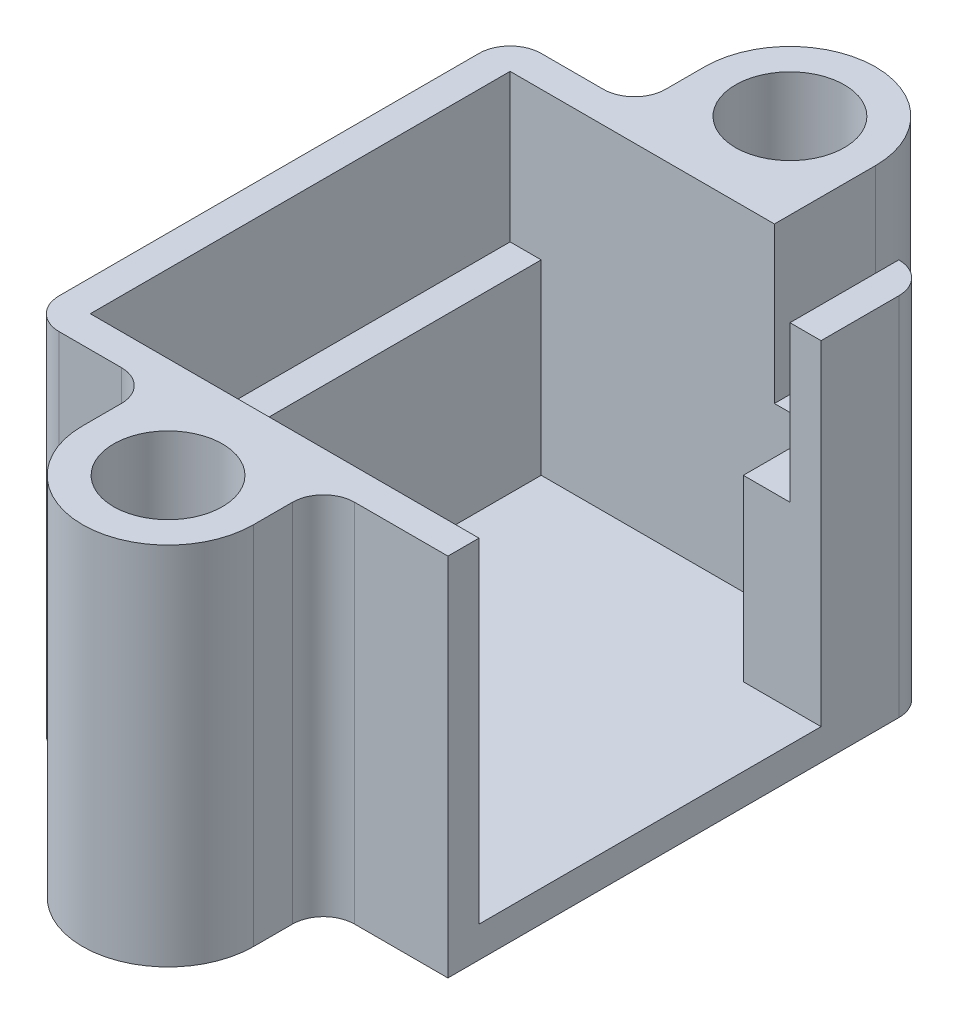
ISO-10303-21;
HEADER;
FILE_DESCRIPTION(('STEP AP214'),'2;1');
FILE_NAME('part.step','',(''),(''),'','','');
FILE_SCHEMA(('AUTOMOTIVE_DESIGN { 1 0 10303 214 1 1 1 1 }'));
ENDSEC;
DATA;
#1=APPLICATION_CONTEXT('core data for automotive mechanical design processes');
#2=APPLICATION_PROTOCOL_DEFINITION('international standard','automotive_design',2000,#1);
#3=PRODUCT_CONTEXT('',#1,'mechanical');
#4=PRODUCT('Part','Part','',(#3));
#5=PRODUCT_RELATED_PRODUCT_CATEGORY('part','',(#4));
#6=PRODUCT_DEFINITION_FORMATION('','',#4);
#7=PRODUCT_DEFINITION_CONTEXT('part definition',#1,'design');
#8=PRODUCT_DEFINITION('design','',#6,#7);
#9=PRODUCT_DEFINITION_SHAPE('','',#8);
#10=(LENGTH_UNIT() NAMED_UNIT(*) SI_UNIT(.MILLI.,.METRE.));
#11=(NAMED_UNIT(*) PLANE_ANGLE_UNIT() SI_UNIT($,.RADIAN.));
#12=(NAMED_UNIT(*) SI_UNIT($,.STERADIAN.) SOLID_ANGLE_UNIT());
#13=UNCERTAINTY_MEASURE_WITH_UNIT(LENGTH_MEASURE(1.E-05),#10,'distance_accuracy_value','');
#14=(GEOMETRIC_REPRESENTATION_CONTEXT(3) GLOBAL_UNCERTAINTY_ASSIGNED_CONTEXT((#13)) GLOBAL_UNIT_ASSIGNED_CONTEXT((#10,
#11,#12)) REPRESENTATION_CONTEXT('',''));
#15=CARTESIAN_POINT('',(0.,0.,0.));
#16=DIRECTION('',(0.,0.,1.));
#17=DIRECTION('',(1.,0.,0.));
#18=AXIS2_PLACEMENT_3D('',#15,#16,#17);
#19=CARTESIAN_POINT('',(0.,1.,0.));
#20=DIRECTION('',(0.,1.,0.));
#21=DIRECTION('',(0.,0.,1.));
#22=AXIS2_PLACEMENT_3D('',#19,#20,#21);
#23=PLANE('',#22);
#24=DIRECTION('',(1.,0.,0.));
#25=VECTOR('',#24,1.);
#26=CARTESIAN_POINT('',(0.,1.,-4.25));
#27=LINE('',#26,#25);
#28=CARTESIAN_POINT('',(4.25,1.,-4.25));
#29=VERTEX_POINT('',#28);
#30=CARTESIAN_POINT('',(6.75,1.,-4.25));
#31=VERTEX_POINT('',#30);
#32=EDGE_CURVE('E332',#29,#31,#27,.T.);
#33=ORIENTED_EDGE('',*,*,#32,.F.);
#34=DIRECTION('',(0.,0.,1.));
#35=VECTOR('',#34,1.);
#36=CARTESIAN_POINT('',(4.25,1.,-6.75));
#37=LINE('',#36,#35);
#38=CARTESIAN_POINT('',(4.25,1.,-6.75));
#39=VERTEX_POINT('',#38);
#40=EDGE_CURVE('E237',#39,#29,#37,.T.);
#41=ORIENTED_EDGE('',*,*,#40,.F.);
#42=DIRECTION('',(-1.,0.,0.));
#43=VECTOR('',#42,1.);
#44=CARTESIAN_POINT('',(0.,1.,-6.75));
#45=LINE('',#44,#43);
#46=CARTESIAN_POINT('',(-4.75,1.,-6.75));
#47=VERTEX_POINT('',#46);
#48=EDGE_CURVE('E472',#39,#47,#45,.T.);
#49=ORIENTED_EDGE('',*,*,#48,.T.);
#50=DIRECTION('',(0.,0.,-1.));
#51=VECTOR('',#50,1.);
#52=CARTESIAN_POINT('',(-4.75,1.,-6.75));
#53=LINE('',#52,#51);
#54=CARTESIAN_POINT('',(-4.75,1.,6.75));
#55=VERTEX_POINT('',#54);
#56=EDGE_CURVE('E60',#55,#47,#53,.T.);
#57=ORIENTED_EDGE('',*,*,#56,.F.);
#58=DIRECTION('',(1.,0.,0.));
#59=VECTOR('',#58,1.);
#60=CARTESIAN_POINT('',(0.,1.,6.75));
#61=LINE('',#60,#59);
#62=CARTESIAN_POINT('',(6.75,1.,6.75));
#63=VERTEX_POINT('',#62);
#64=EDGE_CURVE('E39',#55,#63,#61,.T.);
#65=ORIENTED_EDGE('',*,*,#64,.T.);
#66=DIRECTION('',(0.,0.,1.));
#67=VECTOR('',#66,1.);
#68=CARTESIAN_POINT('',(6.75,1.,0.));
#69=LINE('',#68,#67);
#70=EDGE_CURVE('E438',#31,#63,#69,.T.);
#71=ORIENTED_EDGE('',*,*,#70,.F.);
#72=EDGE_LOOP('',(#33,#41,#49,#57,#65,#71));
#73=FACE_BOUND('',#72,.T.);
#74=ADVANCED_FACE('F35',(#73),#23,.T.);
#75=CARTESIAN_POINT('',(0.,11.75,-6.75));
#76=DIRECTION('',(0.,0.,1.));
#77=DIRECTION('',(1.,0.,0.));
#78=AXIS2_PLACEMENT_3D('',#75,#76,#77);
#79=PLANE('',#78);
#80=ORIENTED_EDGE('',*,*,#48,.F.);
#81=DIRECTION('',(0.,-1.,0.));
#82=VECTOR('',#81,1.);
#83=CARTESIAN_POINT('',(4.25,9.66547594742265,-6.75));
#84=LINE('',#83,#82);
#85=CARTESIAN_POINT('',(4.25,6.75,-6.75));
#86=VERTEX_POINT('',#85);
#87=EDGE_CURVE('E259',#86,#39,#84,.T.);
#88=ORIENTED_EDGE('',*,*,#87,.F.);
#89=DIRECTION('',(1.,0.,0.));
#90=VECTOR('',#89,1.);
#91=CARTESIAN_POINT('',(5.75,6.75,-6.75));
#92=LINE('',#91,#90);
#93=CARTESIAN_POINT('',(2.75,6.75,-6.75));
#94=VERTEX_POINT('',#93);
#95=EDGE_CURVE('E253',#94,#86,#92,.T.);
#96=ORIENTED_EDGE('',*,*,#95,.F.);
#97=DIRECTION('',(0.,1.,0.));
#98=VECTOR('',#97,1.);
#99=CARTESIAN_POINT('',(2.75,6.75,-6.75));
#100=LINE('',#99,#98);
#101=CARTESIAN_POINT('',(2.75,11.75,-6.75));
#102=VERTEX_POINT('',#101);
#103=EDGE_CURVE('E323',#94,#102,#100,.T.);
#104=ORIENTED_EDGE('',*,*,#103,.T.);
#105=DIRECTION('',(-1.,0.,0.));
#106=VECTOR('',#105,1.);
#107=CARTESIAN_POINT('',(0.,11.75,-6.75));
#108=LINE('',#107,#106);
#109=CARTESIAN_POINT('',(-5.75,11.75,-6.75));
#110=VERTEX_POINT('',#109);
#111=EDGE_CURVE('E335',#102,#110,#108,.T.);
#112=ORIENTED_EDGE('',*,*,#111,.T.);
#113=DIRECTION('',(0.,-1.,0.));
#114=VECTOR('',#113,1.);
#115=CARTESIAN_POINT('',(-5.75,11.75,-6.75));
#116=LINE('',#115,#114);
#117=CARTESIAN_POINT('',(-5.75,7.,-6.75));
#118=VERTEX_POINT('',#117);
#119=EDGE_CURVE('E517',#110,#118,#116,.T.);
#120=ORIENTED_EDGE('',*,*,#119,.T.);
#121=DIRECTION('',(-1.,0.,0.));
#122=VECTOR('',#121,1.);
#123=CARTESIAN_POINT('',(-5.75,7.,-6.75));
#124=LINE('',#123,#122);
#125=CARTESIAN_POINT('',(-4.75,7.,-6.75));
#126=VERTEX_POINT('',#125);
#127=EDGE_CURVE('E268',#126,#118,#124,.T.);
#128=ORIENTED_EDGE('',*,*,#127,.F.);
#129=DIRECTION('',(0.,-1.,0.));
#130=VECTOR('',#129,1.);
#131=CARTESIAN_POINT('',(-4.75,7.,-6.75));
#132=LINE('',#131,#130);
#133=EDGE_CURVE('E270',#126,#47,#132,.T.);
#134=ORIENTED_EDGE('',*,*,#133,.T.);
#135=EDGE_LOOP('',(#80,#88,#96,#104,#112,#120,#128,#134));
#136=FACE_BOUND('',#135,.T.);
#137=ADVANCED_FACE('F509',(#136),#79,.T.);
#138=CARTESIAN_POINT('',(0.,11.75,6.75));
#139=DIRECTION('',(0.,0.,-1.));
#140=DIRECTION('',(-1.,0.,0.));
#141=AXIS2_PLACEMENT_3D('',#138,#139,#140);
#142=PLANE('',#141);
#143=ORIENTED_EDGE('',*,*,#64,.F.);
#144=DIRECTION('',(0.,-1.,0.));
#145=VECTOR('',#144,1.);
#146=CARTESIAN_POINT('',(-4.75,7.,6.75));
#147=LINE('',#146,#145);
#148=CARTESIAN_POINT('',(-4.75,7.,6.75));
#149=VERTEX_POINT('',#148);
#150=EDGE_CURVE('E52',#149,#55,#147,.T.);
#151=ORIENTED_EDGE('',*,*,#150,.F.);
#152=DIRECTION('',(1.,0.,0.));
#153=VECTOR('',#152,1.);
#154=CARTESIAN_POINT('',(-5.75,7.,6.75));
#155=LINE('',#154,#153);
#156=CARTESIAN_POINT('',(-5.75,7.,6.75));
#157=VERTEX_POINT('',#156);
#158=EDGE_CURVE('E263',#157,#149,#155,.T.);
#159=ORIENTED_EDGE('',*,*,#158,.F.);
#160=DIRECTION('',(0.,-1.,0.));
#161=VECTOR('',#160,1.);
#162=CARTESIAN_POINT('',(-5.75,11.75,6.75));
#163=LINE('',#162,#161);
#164=CARTESIAN_POINT('',(-5.75,11.75,6.75));
#165=VERTEX_POINT('',#164);
#166=EDGE_CURVE('E465',#165,#157,#163,.T.);
#167=ORIENTED_EDGE('',*,*,#166,.F.);
#168=DIRECTION('',(1.,0.,0.));
#169=VECTOR('',#168,1.);
#170=CARTESIAN_POINT('',(0.,11.75,6.75));
#171=LINE('',#170,#169);
#172=CARTESIAN_POINT('',(6.75,11.75,6.75));
#173=VERTEX_POINT('',#172);
#174=EDGE_CURVE('E328',#165,#173,#171,.T.);
#175=ORIENTED_EDGE('',*,*,#174,.T.);
#176=DIRECTION('',(0.,-1.,0.));
#177=VECTOR('',#176,1.);
#178=CARTESIAN_POINT('',(6.75,11.75,6.75));
#179=LINE('',#178,#177);
#180=EDGE_CURVE('E478',#173,#63,#179,.T.);
#181=ORIENTED_EDGE('',*,*,#180,.T.);
#182=EDGE_LOOP('',(#143,#151,#159,#167,#175,#181));
#183=FACE_BOUND('',#182,.T.);
#184=ADVANCED_FACE('F590',(#183),#142,.T.);
#185=CARTESIAN_POINT('',(0.,1.,7.75));
#186=DIRECTION('',(0.,0.,-1.));
#187=DIRECTION('',(-1.,0.,0.));
#188=AXIS2_PLACEMENT_3D('',#185,#186,#187);
#189=PLANE('',#188);
#190=DIRECTION('',(1.,0.,0.));
#191=VECTOR('',#190,1.);
#192=CARTESIAN_POINT('',(0.,11.75,7.75));
#193=LINE('',#192,#191);
#194=CARTESIAN_POINT('',(3.75,11.75,7.75));
#195=VERTEX_POINT('',#194);
#196=CARTESIAN_POINT('',(6.75,11.75,7.75));
#197=VERTEX_POINT('',#196);
#198=EDGE_CURVE('E528',#195,#197,#193,.T.);
#199=ORIENTED_EDGE('',*,*,#198,.F.);
#200=DIRECTION('',(0.,1.,0.));
#201=VECTOR('',#200,1.);
#202=CARTESIAN_POINT('',(3.75,1.,7.75));
#203=LINE('',#202,#201);
#204=CARTESIAN_POINT('',(3.75,0.,7.75));
#205=VERTEX_POINT('',#204);
#206=EDGE_CURVE('E532',#195,#205,#203,.F.);
#207=ORIENTED_EDGE('',*,*,#206,.T.);
#208=DIRECTION('',(1.,0.,0.));
#209=VECTOR('',#208,1.);
#210=CARTESIAN_POINT('',(0.,0.,7.75));
#211=LINE('',#210,#209);
#212=CARTESIAN_POINT('',(6.75,0.,7.75));
#213=VERTEX_POINT('',#212);
#214=EDGE_CURVE('E439',#205,#213,#211,.T.);
#215=ORIENTED_EDGE('',*,*,#214,.T.);
#216=DIRECTION('',(0.,-1.,0.));
#217=VECTOR('',#216,1.);
#218=CARTESIAN_POINT('',(6.75,1.,7.75));
#219=LINE('',#218,#217);
#220=EDGE_CURVE('E444',#197,#213,#219,.T.);
#221=ORIENTED_EDGE('',*,*,#220,.F.);
#222=EDGE_LOOP('',(#199,#207,#215,#221));
#223=FACE_BOUND('',#222,.T.);
#224=ADVANCED_FACE('F627',(#223),#189,.F.);
#225=CARTESIAN_POINT('',(0.,1.,-7.75));
#226=DIRECTION('',(0.,0.,-1.));
#227=DIRECTION('',(-1.,0.,0.));
#228=AXIS2_PLACEMENT_3D('',#225,#226,#227);
#229=PLANE('',#228);
#230=DIRECTION('',(1.,0.,0.));
#231=VECTOR('',#230,1.);
#232=CARTESIAN_POINT('',(0.,0.,-7.75));
#233=LINE('',#232,#231);
#234=CARTESIAN_POINT('',(3.75,0.,-7.75));
#235=VERTEX_POINT('',#234);
#236=CARTESIAN_POINT('',(5.75,0.,-7.75));
#237=VERTEX_POINT('',#236);
#238=EDGE_CURVE('E456',#235,#237,#233,.T.);
#239=ORIENTED_EDGE('',*,*,#238,.F.);
#240=DIRECTION('',(0.,1.,0.));
#241=VECTOR('',#240,1.);
#242=CARTESIAN_POINT('',(3.75,1.,-7.75));
#243=LINE('',#242,#241);
#244=CARTESIAN_POINT('',(3.75,6.75,-7.75));
#245=VERTEX_POINT('',#244);
#246=EDGE_CURVE('E450',#235,#245,#243,.T.);
#247=ORIENTED_EDGE('',*,*,#246,.T.);
#248=DIRECTION('',(-1.,0.,0.));
#249=VECTOR('',#248,1.);
#250=CARTESIAN_POINT('',(5.75,6.75,-7.75));
#251=LINE('',#250,#249);
#252=CARTESIAN_POINT('',(5.75,6.75,-7.75));
#253=VERTEX_POINT('',#252);
#254=EDGE_CURVE('E318',#253,#245,#251,.T.);
#255=ORIENTED_EDGE('',*,*,#254,.F.);
#256=DIRECTION('',(0.,-1.,0.));
#257=VECTOR('',#256,1.);
#258=CARTESIAN_POINT('',(5.75,1.,-7.75));
#259=LINE('',#258,#257);
#260=EDGE_CURVE('E454',#253,#237,#259,.T.);
#261=ORIENTED_EDGE('',*,*,#260,.T.);
#262=EDGE_LOOP('',(#239,#247,#255,#261));
#263=FACE_BOUND('',#262,.T.);
#264=ADVANCED_FACE('F494',(#263),#229,.T.);
#265=CARTESIAN_POINT('',(0.,11.75,0.));
#266=DIRECTION('',(0.,1.,0.));
#267=DIRECTION('',(0.,0.,1.));
#268=AXIS2_PLACEMENT_3D('',#265,#266,#267);
#269=PLANE('',#268);
#270=DIRECTION('',(0.,0.,-1.));
#271=VECTOR('',#270,1.);
#272=CARTESIAN_POINT('',(6.75,11.75,0.));
#273=LINE('',#272,#271);
#274=CARTESIAN_POINT('',(6.75,11.75,-4.25));
#275=VERTEX_POINT('',#274);
#276=CARTESIAN_POINT('',(6.75,11.75,-6.75));
#277=VERTEX_POINT('',#276);
#278=EDGE_CURVE('E342',#275,#277,#273,.T.);
#279=ORIENTED_EDGE('',*,*,#278,.T.);
#280=CARTESIAN_POINT('',(5.75,11.75,-6.75));
#281=DIRECTION('',(0.,1.,0.));
#282=DIRECTION('',(0.,0.,1.));
#283=AXIS2_PLACEMENT_3D('',#280,#281,#282);
#284=CIRCLE('',#283,1.);
#285=CARTESIAN_POINT('',(5.75,11.75,-7.75));
#286=VERTEX_POINT('',#285);
#287=EDGE_CURVE('E541',#277,#286,#284,.T.);
#288=ORIENTED_EDGE('',*,*,#287,.T.);
#289=DIRECTION('',(0.,0.,-1.));
#290=VECTOR('',#289,1.);
#291=CARTESIAN_POINT('',(5.75,11.75,0.));
#292=LINE('',#291,#290);
#293=CARTESIAN_POINT('',(5.75,11.75,-4.25));
#294=VERTEX_POINT('',#293);
#295=EDGE_CURVE('E337',#294,#286,#292,.T.);
#296=ORIENTED_EDGE('',*,*,#295,.F.);
#297=DIRECTION('',(1.,0.,0.));
#298=VECTOR('',#297,1.);
#299=CARTESIAN_POINT('',(0.,11.75,-4.25));
#300=LINE('',#299,#298);
#301=EDGE_CURVE('E340',#294,#275,#300,.T.);
#302=ORIENTED_EDGE('',*,*,#301,.T.);
#303=EDGE_LOOP('',(#279,#288,#296,#302));
#304=FACE_BOUND('',#303,.T.);
#305=ADVANCED_FACE('F600',(#304),#269,.T.);
#306=CARTESIAN_POINT('',(6.75,1.,0.));
#307=DIRECTION('',(1.,0.,0.));
#308=DIRECTION('',(0.,0.,-1.));
#309=AXIS2_PLACEMENT_3D('',#306,#307,#308);
#310=PLANE('',#309);
#311=DIRECTION('',(0.,0.,1.));
#312=VECTOR('',#311,1.);
#313=CARTESIAN_POINT('',(6.75,0.,0.));
#314=LINE('',#313,#312);
#315=CARTESIAN_POINT('',(6.75,0.,-6.75));
#316=VERTEX_POINT('',#315);
#317=EDGE_CURVE('E458',#316,#213,#314,.T.);
#318=ORIENTED_EDGE('',*,*,#317,.F.);
#319=DIRECTION('',(0.,-1.,0.));
#320=VECTOR('',#319,1.);
#321=CARTESIAN_POINT('',(6.75,1.,-6.75));
#322=LINE('',#321,#320);
#323=EDGE_CURVE('E547',#316,#277,#322,.F.);
#324=ORIENTED_EDGE('',*,*,#323,.T.);
#325=ORIENTED_EDGE('',*,*,#278,.F.);
#326=DIRECTION('',(0.,-1.,0.));
#327=VECTOR('',#326,1.);
#328=CARTESIAN_POINT('',(6.75,11.75,-4.25));
#329=LINE('',#328,#327);
#330=EDGE_CURVE('E475',#275,#31,#329,.T.);
#331=ORIENTED_EDGE('',*,*,#330,.T.);
#332=ORIENTED_EDGE('',*,*,#70,.T.);
#333=ORIENTED_EDGE('',*,*,#180,.F.);
#334=EDGE_CURVE('E346',#197,#173,#273,.T.);
#335=ORIENTED_EDGE('',*,*,#334,.F.);
#336=ORIENTED_EDGE('',*,*,#220,.T.);
#337=EDGE_LOOP('',(#318,#324,#325,#331,#332,#333,#335,#336));
#338=FACE_BOUND('',#337,.T.);
#339=ADVANCED_FACE('F588',(#338),#310,.T.);
#340=CARTESIAN_POINT('',(-5.75,0.,-7.75));
#341=VERTEX_POINT('',#340);
#342=CARTESIAN_POINT('',(-3.75,0.,-7.75));
#343=VERTEX_POINT('',#342);
#344=EDGE_CURVE('E404',#341,#343,#233,.T.);
#345=ORIENTED_EDGE('',*,*,#344,.F.);
#346=DIRECTION('',(0.,-1.,0.));
#347=VECTOR('',#346,1.);
#348=CARTESIAN_POINT('',(-5.75,11.75,-7.75));
#349=LINE('',#348,#347);
#350=CARTESIAN_POINT('',(-5.75,11.75,-7.75));
#351=VERTEX_POINT('',#350);
#352=EDGE_CURVE('E363',#341,#351,#349,.F.);
#353=ORIENTED_EDGE('',*,*,#352,.T.);
#354=DIRECTION('',(-1.,0.,0.));
#355=VECTOR('',#354,1.);
#356=CARTESIAN_POINT('',(0.,11.75,-7.75));
#357=LINE('',#356,#355);
#358=CARTESIAN_POINT('',(-3.75,11.75,-7.75));
#359=VERTEX_POINT('',#358);
#360=EDGE_CURVE('E345',#359,#351,#357,.T.);
#361=ORIENTED_EDGE('',*,*,#360,.F.);
#362=DIRECTION('',(0.,1.,0.));
#363=VECTOR('',#362,1.);
#364=CARTESIAN_POINT('',(-3.75,0.,-7.75));
#365=LINE('',#364,#363);
#366=EDGE_CURVE('E361',#359,#343,#365,.F.);
#367=ORIENTED_EDGE('',*,*,#366,.T.);
#368=EDGE_LOOP('',(#345,#353,#361,#367));
#369=FACE_BOUND('',#368,.T.);
#370=ADVANCED_FACE('F394',(#369),#229,.T.);
#371=CARTESIAN_POINT('',(-6.75,1.,0.));
#372=DIRECTION('',(1.,0.,0.));
#373=DIRECTION('',(0.,0.,-1.));
#374=AXIS2_PLACEMENT_3D('',#371,#372,#373);
#375=PLANE('',#374);
#376=DIRECTION('',(0.,0.,1.));
#377=VECTOR('',#376,1.);
#378=CARTESIAN_POINT('',(-6.75,0.,0.));
#379=LINE('',#378,#377);
#380=CARTESIAN_POINT('',(-6.75,0.,-6.75));
#381=VERTEX_POINT('',#380);
#382=CARTESIAN_POINT('',(-6.75,0.,6.75));
#383=VERTEX_POINT('',#382);
#384=EDGE_CURVE('E443',#381,#383,#379,.T.);
#385=ORIENTED_EDGE('',*,*,#384,.T.);
#386=DIRECTION('',(0.,-1.,0.));
#387=VECTOR('',#386,1.);
#388=CARTESIAN_POINT('',(-6.75,1.,6.75));
#389=LINE('',#388,#387);
#390=CARTESIAN_POINT('',(-6.75,11.75,6.75));
#391=VERTEX_POINT('',#390);
#392=EDGE_CURVE('E355',#383,#391,#389,.F.);
#393=ORIENTED_EDGE('',*,*,#392,.T.);
#394=DIRECTION('',(0.,0.,1.));
#395=VECTOR('',#394,1.);
#396=CARTESIAN_POINT('',(-6.75,11.75,0.));
#397=LINE('',#396,#395);
#398=CARTESIAN_POINT('',(-6.75,11.75,-6.75));
#399=VERTEX_POINT('',#398);
#400=EDGE_CURVE('E349',#399,#391,#397,.T.);
#401=ORIENTED_EDGE('',*,*,#400,.F.);
#402=DIRECTION('',(0.,-1.,0.));
#403=VECTOR('',#402,1.);
#404=CARTESIAN_POINT('',(-6.75,0.,-6.75));
#405=LINE('',#404,#403);
#406=EDGE_CURVE('E562',#399,#381,#405,.T.);
#407=ORIENTED_EDGE('',*,*,#406,.T.);
#408=EDGE_LOOP('',(#385,#393,#401,#407));
#409=FACE_BOUND('',#408,.T.);
#410=ADVANCED_FACE('F566',(#409),#375,.F.);
#411=CARTESIAN_POINT('',(-5.75,0.,7.75));
#412=VERTEX_POINT('',#411);
#413=CARTESIAN_POINT('',(-3.75,0.,7.75));
#414=VERTEX_POINT('',#413);
#415=EDGE_CURVE('E435',#412,#414,#211,.T.);
#416=ORIENTED_EDGE('',*,*,#415,.T.);
#417=DIRECTION('',(0.,1.,0.));
#418=VECTOR('',#417,1.);
#419=CARTESIAN_POINT('',(-3.75,11.75,7.75));
#420=LINE('',#419,#418);
#421=CARTESIAN_POINT('',(-3.75,11.75,7.75));
#422=VERTEX_POINT('',#421);
#423=EDGE_CURVE('E539',#414,#422,#420,.T.);
#424=ORIENTED_EDGE('',*,*,#423,.T.);
#425=CARTESIAN_POINT('',(-5.75,11.75,7.75));
#426=VERTEX_POINT('',#425);
#427=EDGE_CURVE('E524',#426,#422,#193,.T.);
#428=ORIENTED_EDGE('',*,*,#427,.F.);
#429=DIRECTION('',(0.,-1.,0.));
#430=VECTOR('',#429,1.);
#431=CARTESIAN_POINT('',(-5.75,1.,7.75));
#432=LINE('',#431,#430);
#433=EDGE_CURVE('E533',#426,#412,#432,.T.);
#434=ORIENTED_EDGE('',*,*,#433,.T.);
#435=EDGE_LOOP('',(#416,#424,#428,#434));
#436=FACE_BOUND('',#435,.T.);
#437=ADVANCED_FACE('F577',(#436),#189,.F.);
#438=CARTESIAN_POINT('',(0.,0.,0.));
#439=DIRECTION('',(0.,1.,0.));
#440=DIRECTION('',(0.,0.,1.));
#441=AXIS2_PLACEMENT_3D('',#438,#439,#440);
#442=PLANE('',#441);
#443=ORIENTED_EDGE('',*,*,#238,.T.);
#444=CARTESIAN_POINT('',(5.75,0.,-6.75));
#445=DIRECTION('',(0.,1.,0.));
#446=DIRECTION('',(0.,0.,1.));
#447=AXIS2_PLACEMENT_3D('',#444,#445,#446);
#448=CIRCLE('',#447,1.);
#449=EDGE_CURVE('E551',#237,#316,#448,.F.);
#450=ORIENTED_EDGE('',*,*,#449,.T.);
#451=ORIENTED_EDGE('',*,*,#317,.T.);
#452=ORIENTED_EDGE('',*,*,#214,.F.);
#453=CARTESIAN_POINT('',(3.75,0.,8.75));
#454=DIRECTION('',(0.,1.,0.));
#455=DIRECTION('',(0.,0.,1.));
#456=AXIS2_PLACEMENT_3D('',#453,#454,#455);
#457=CIRCLE('',#456,1.);
#458=CARTESIAN_POINT('',(2.75,0.,8.75));
#459=VERTEX_POINT('',#458);
#460=EDGE_CURVE('E375',#205,#459,#457,.T.);
#461=ORIENTED_EDGE('',*,*,#460,.T.);
#462=DIRECTION('',(0.,0.,1.));
#463=VECTOR('',#462,1.);
#464=CARTESIAN_POINT('',(2.75,0.,0.));
#465=LINE('',#464,#463);
#466=CARTESIAN_POINT('',(2.75,0.,10.));
#467=VERTEX_POINT('',#466);
#468=EDGE_CURVE('E294',#459,#467,#465,.T.);
#469=ORIENTED_EDGE('',*,*,#468,.T.);
#470=CARTESIAN_POINT('',(0.,0.,10.));
#471=DIRECTION('',(0.,1.,0.));
#472=DIRECTION('',(0.,0.,1.));
#473=AXIS2_PLACEMENT_3D('',#470,#471,#472);
#474=CIRCLE('',#473,2.75);
#475=CARTESIAN_POINT('',(-2.75,0.,10.));
#476=VERTEX_POINT('',#475);
#477=EDGE_CURVE('E286',#476,#467,#474,.T.);
#478=ORIENTED_EDGE('',*,*,#477,.F.);
#479=DIRECTION('',(0.,0.,1.));
#480=VECTOR('',#479,1.);
#481=CARTESIAN_POINT('',(-2.75,0.,0.));
#482=LINE('',#481,#480);
#483=CARTESIAN_POINT('',(-2.75,0.,8.75));
#484=VERTEX_POINT('',#483);
#485=EDGE_CURVE('E275',#484,#476,#482,.T.);
#486=ORIENTED_EDGE('',*,*,#485,.F.);
#487=CARTESIAN_POINT('',(-3.75,0.,8.75));
#488=DIRECTION('',(0.,1.,0.));
#489=DIRECTION('',(0.,0.,1.));
#490=AXIS2_PLACEMENT_3D('',#487,#488,#489);
#491=CIRCLE('',#490,1.);
#492=EDGE_CURVE('E379',#484,#414,#491,.T.);
#493=ORIENTED_EDGE('',*,*,#492,.T.);
#494=ORIENTED_EDGE('',*,*,#415,.F.);
#495=CARTESIAN_POINT('',(-5.75,0.,6.75));
#496=DIRECTION('',(0.,1.,0.));
#497=DIRECTION('',(0.,0.,1.));
#498=AXIS2_PLACEMENT_3D('',#495,#496,#497);
#499=CIRCLE('',#498,1.);
#500=EDGE_CURVE('E554',#412,#383,#499,.F.);
#501=ORIENTED_EDGE('',*,*,#500,.T.);
#502=ORIENTED_EDGE('',*,*,#384,.F.);
#503=CARTESIAN_POINT('',(-5.75,0.,-6.75));
#504=DIRECTION('',(0.,1.,0.));
#505=DIRECTION('',(0.,0.,1.));
#506=AXIS2_PLACEMENT_3D('',#503,#504,#505);
#507=CIRCLE('',#506,1.);
#508=EDGE_CURVE('E414',#381,#341,#507,.F.);
#509=ORIENTED_EDGE('',*,*,#508,.T.);
#510=ORIENTED_EDGE('',*,*,#344,.T.);
#511=CARTESIAN_POINT('',(-3.75,0.,-8.75));
#512=DIRECTION('',(0.,1.,0.));
#513=DIRECTION('',(0.,0.,1.));
#514=AXIS2_PLACEMENT_3D('',#511,#512,#513);
#515=CIRCLE('',#514,1.);
#516=CARTESIAN_POINT('',(-2.75,0.,-8.75));
#517=VERTEX_POINT('',#516);
#518=EDGE_CURVE('E11',#343,#517,#515,.T.);
#519=ORIENTED_EDGE('',*,*,#518,.T.);
#520=DIRECTION('',(0.,0.,-1.));
#521=VECTOR('',#520,1.);
#522=CARTESIAN_POINT('',(-2.75,0.,0.));
#523=LINE('',#522,#521);
#524=CARTESIAN_POINT('',(-2.75,0.,-10.));
#525=VERTEX_POINT('',#524);
#526=EDGE_CURVE('E298',#517,#525,#523,.T.);
#527=ORIENTED_EDGE('',*,*,#526,.T.);
#528=CARTESIAN_POINT('',(0.,0.,-10.));
#529=DIRECTION('',(0.,1.,0.));
#530=DIRECTION('',(0.,0.,1.));
#531=AXIS2_PLACEMENT_3D('',#528,#529,#530);
#532=CIRCLE('',#531,2.75);
#533=CARTESIAN_POINT('',(2.75,0.,-10.));
#534=VERTEX_POINT('',#533);
#535=EDGE_CURVE('E295',#525,#534,#532,.F.);
#536=ORIENTED_EDGE('',*,*,#535,.T.);
#537=DIRECTION('',(0.,0.,-1.));
#538=VECTOR('',#537,1.);
#539=CARTESIAN_POINT('',(2.75,0.,0.));
#540=LINE('',#539,#538);
#541=CARTESIAN_POINT('',(2.75,0.,-8.75));
#542=VERTEX_POINT('',#541);
#543=EDGE_CURVE('E299',#542,#534,#540,.T.);
#544=ORIENTED_EDGE('',*,*,#543,.F.);
#545=CARTESIAN_POINT('',(3.75,0.,-8.75));
#546=DIRECTION('',(0.,1.,0.));
#547=DIRECTION('',(0.,0.,1.));
#548=AXIS2_PLACEMENT_3D('',#545,#546,#547);
#549=CIRCLE('',#548,1.);
#550=EDGE_CURVE('E371',#542,#235,#549,.T.);
#551=ORIENTED_EDGE('',*,*,#550,.T.);
#552=EDGE_LOOP('',(#443,#450,#451,#452,#461,#469,#478,#486,#493,#494,#501,#502,#509,#510,#519,
#527,#536,#544,#551));
#553=FACE_BOUND('',#552,.T.);
#554=CARTESIAN_POINT('',(0.,0.,-10.));
#555=DIRECTION('',(0.,1.,0.));
#556=DIRECTION('',(0.,0.,1.));
#557=AXIS2_PLACEMENT_3D('',#554,#555,#556);
#558=CIRCLE('',#557,1.75);
#559=CARTESIAN_POINT('',(0.,0.,-8.25));
#560=VERTEX_POINT('',#559);
#561=EDGE_CURVE('E300',#560,#560,#558,.F.);
#562=ORIENTED_EDGE('',*,*,#561,.F.);
#563=EDGE_LOOP('',(#562));
#564=FACE_BOUND('',#563,.T.);
#565=CARTESIAN_POINT('',(0.,0.,10.));
#566=DIRECTION('',(0.,1.,0.));
#567=DIRECTION('',(0.,0.,1.));
#568=AXIS2_PLACEMENT_3D('',#565,#566,#567);
#569=CIRCLE('',#568,1.75);
#570=CARTESIAN_POINT('',(0.,0.,11.75));
#571=VERTEX_POINT('',#570);
#572=EDGE_CURVE('E279',#571,#571,#569,.T.);
#573=ORIENTED_EDGE('',*,*,#572,.T.);
#574=EDGE_LOOP('',(#573));
#575=FACE_BOUND('',#574,.T.);
#576=ADVANCED_FACE('F401',(#553,#564,#575),#442,.F.);
#577=CARTESIAN_POINT('',(-5.75,11.75,0.));
#578=DIRECTION('',(1.,0.,0.));
#579=DIRECTION('',(0.,0.,-1.));
#580=AXIS2_PLACEMENT_3D('',#577,#578,#579);
#581=PLANE('',#580);
#582=DIRECTION('',(0.,0.,1.));
#583=VECTOR('',#582,1.);
#584=CARTESIAN_POINT('',(-5.75,7.,-6.75));
#585=LINE('',#584,#583);
#586=EDGE_CURVE('E255',#118,#157,#585,.T.);
#587=ORIENTED_EDGE('',*,*,#586,.F.);
#588=ORIENTED_EDGE('',*,*,#119,.F.);
#589=DIRECTION('',(0.,0.,1.));
#590=VECTOR('',#589,1.);
#591=CARTESIAN_POINT('',(-5.75,11.75,0.));
#592=LINE('',#591,#590);
#593=EDGE_CURVE('E331',#110,#165,#592,.T.);
#594=ORIENTED_EDGE('',*,*,#593,.T.);
#595=ORIENTED_EDGE('',*,*,#166,.T.);
#596=EDGE_LOOP('',(#587,#588,#594,#595));
#597=FACE_BOUND('',#596,.T.);
#598=ADVANCED_FACE('F516',(#597),#581,.T.);
#599=CARTESIAN_POINT('',(5.75,11.75,0.));
#600=DIRECTION('',(-1.,0.,0.));
#601=DIRECTION('',(0.,0.,1.));
#602=AXIS2_PLACEMENT_3D('',#599,#600,#601);
#603=PLANE('',#602);
#604=DIRECTION('',(0.,0.,-1.));
#605=VECTOR('',#604,1.);
#606=CARTESIAN_POINT('',(5.75,6.75,-6.75));
#607=LINE('',#606,#605);
#608=CARTESIAN_POINT('',(5.75,6.75,-4.25));
#609=VERTEX_POINT('',#608);
#610=EDGE_CURVE('E316',#609,#253,#607,.T.);
#611=ORIENTED_EDGE('',*,*,#610,.F.);
#612=DIRECTION('',(0.,-1.,0.));
#613=VECTOR('',#612,1.);
#614=CARTESIAN_POINT('',(5.75,11.75,-4.25));
#615=LINE('',#614,#613);
#616=EDGE_CURVE('E245',#294,#609,#615,.T.);
#617=ORIENTED_EDGE('',*,*,#616,.F.);
#618=ORIENTED_EDGE('',*,*,#295,.T.);
#619=DIRECTION('',(0.,1.,0.));
#620=VECTOR('',#619,1.);
#621=CARTESIAN_POINT('',(5.75,6.75,-7.75));
#622=LINE('',#621,#620);
#623=EDGE_CURVE('E320',#253,#286,#622,.T.);
#624=ORIENTED_EDGE('',*,*,#623,.F.);
#625=EDGE_LOOP('',(#611,#617,#618,#624));
#626=FACE_BOUND('',#625,.T.);
#627=ADVANCED_FACE('F606',(#626),#603,.T.);
#628=CARTESIAN_POINT('',(0.,11.75,-4.25));
#629=DIRECTION('',(0.,0.,-1.));
#630=DIRECTION('',(-1.,0.,0.));
#631=AXIS2_PLACEMENT_3D('',#628,#629,#630);
#632=PLANE('',#631);
#633=ORIENTED_EDGE('',*,*,#32,.T.);
#634=ORIENTED_EDGE('',*,*,#330,.F.);
#635=ORIENTED_EDGE('',*,*,#301,.F.);
#636=ORIENTED_EDGE('',*,*,#616,.T.);
#637=DIRECTION('',(1.,0.,0.));
#638=VECTOR('',#637,1.);
#639=CARTESIAN_POINT('',(5.75,6.75,-4.25));
#640=LINE('',#639,#638);
#641=CARTESIAN_POINT('',(4.25,6.75,-4.25));
#642=VERTEX_POINT('',#641);
#643=EDGE_CURVE('E239',#642,#609,#640,.T.);
#644=ORIENTED_EDGE('',*,*,#643,.F.);
#645=DIRECTION('',(0.,-1.,0.));
#646=VECTOR('',#645,1.);
#647=CARTESIAN_POINT('',(4.25,9.66547594742265,-4.25));
#648=LINE('',#647,#646);
#649=EDGE_CURVE('E230',#642,#29,#648,.T.);
#650=ORIENTED_EDGE('',*,*,#649,.T.);
#651=EDGE_LOOP('',(#633,#634,#635,#636,#644,#650));
#652=FACE_BOUND('',#651,.T.);
#653=ADVANCED_FACE('F243',(#652),#632,.F.);
#654=ORIENTED_EDGE('',*,*,#400,.T.);
#655=CARTESIAN_POINT('',(-5.75,11.75,6.75));
#656=DIRECTION('',(0.,1.,0.));
#657=DIRECTION('',(0.,0.,1.));
#658=AXIS2_PLACEMENT_3D('',#655,#656,#657);
#659=CIRCLE('',#658,1.);
#660=EDGE_CURVE('E359',#391,#426,#659,.T.);
#661=ORIENTED_EDGE('',*,*,#660,.T.);
#662=ORIENTED_EDGE('',*,*,#427,.T.);
#663=CARTESIAN_POINT('',(-3.75,11.75,8.75));
#664=DIRECTION('',(0.,1.,0.));
#665=DIRECTION('',(0.,0.,1.));
#666=AXIS2_PLACEMENT_3D('',#663,#664,#665);
#667=CIRCLE('',#666,1.);
#668=CARTESIAN_POINT('',(-2.75,11.75,8.75));
#669=VERTEX_POINT('',#668);
#670=EDGE_CURVE('E377',#422,#669,#667,.F.);
#671=ORIENTED_EDGE('',*,*,#670,.T.);
#672=DIRECTION('',(0.,0.,-1.));
#673=VECTOR('',#672,1.);
#674=CARTESIAN_POINT('',(-2.75,11.75,0.));
#675=LINE('',#674,#673);
#676=CARTESIAN_POINT('',(-2.75,11.75,10.));
#677=VERTEX_POINT('',#676);
#678=EDGE_CURVE('E289',#677,#669,#675,.T.);
#679=ORIENTED_EDGE('',*,*,#678,.F.);
#680=CARTESIAN_POINT('',(0.,11.75,10.));
#681=DIRECTION('',(0.,1.,0.));
#682=DIRECTION('',(0.,0.,1.));
#683=AXIS2_PLACEMENT_3D('',#680,#681,#682);
#684=CIRCLE('',#683,2.75);
#685=CARTESIAN_POINT('',(2.75,11.75,10.));
#686=VERTEX_POINT('',#685);
#687=EDGE_CURVE('E281',#686,#677,#684,.F.);
#688=ORIENTED_EDGE('',*,*,#687,.F.);
#689=DIRECTION('',(0.,0.,-1.));
#690=VECTOR('',#689,1.);
#691=CARTESIAN_POINT('',(2.75,11.75,0.));
#692=LINE('',#691,#690);
#693=CARTESIAN_POINT('',(2.75,11.75,8.75));
#694=VERTEX_POINT('',#693);
#695=EDGE_CURVE('E280',#686,#694,#692,.T.);
#696=ORIENTED_EDGE('',*,*,#695,.T.);
#697=CARTESIAN_POINT('',(3.75,11.75,8.75));
#698=DIRECTION('',(0.,1.,0.));
#699=DIRECTION('',(0.,0.,1.));
#700=AXIS2_PLACEMENT_3D('',#697,#698,#699);
#701=CIRCLE('',#700,1.);
#702=EDGE_CURVE('E373',#694,#195,#701,.F.);
#703=ORIENTED_EDGE('',*,*,#702,.T.);
#704=ORIENTED_EDGE('',*,*,#198,.T.);
#705=ORIENTED_EDGE('',*,*,#334,.T.);
#706=ORIENTED_EDGE('',*,*,#174,.F.);
#707=ORIENTED_EDGE('',*,*,#593,.F.);
#708=ORIENTED_EDGE('',*,*,#111,.F.);
#709=DIRECTION('',(0.,0.,1.));
#710=VECTOR('',#709,1.);
#711=CARTESIAN_POINT('',(2.75,11.75,-6.75));
#712=LINE('',#711,#710);
#713=CARTESIAN_POINT('',(2.75,11.75,-10.));
#714=VERTEX_POINT('',#713);
#715=EDGE_CURVE('E303',#714,#102,#712,.T.);
#716=ORIENTED_EDGE('',*,*,#715,.F.);
#717=CARTESIAN_POINT('',(0.,11.75,-10.));
#718=DIRECTION('',(0.,1.,0.));
#719=DIRECTION('',(0.,0.,1.));
#720=AXIS2_PLACEMENT_3D('',#717,#718,#719);
#721=CIRCLE('',#720,2.75);
#722=CARTESIAN_POINT('',(-2.75,11.75,-10.));
#723=VERTEX_POINT('',#722);
#724=EDGE_CURVE('E307',#714,#723,#721,.T.);
#725=ORIENTED_EDGE('',*,*,#724,.T.);
#726=DIRECTION('',(0.,0.,1.));
#727=VECTOR('',#726,1.);
#728=CARTESIAN_POINT('',(-2.75,11.75,0.));
#729=LINE('',#728,#727);
#730=CARTESIAN_POINT('',(-2.75,11.75,-8.75));
#731=VERTEX_POINT('',#730);
#732=EDGE_CURVE('E310',#723,#731,#729,.T.);
#733=ORIENTED_EDGE('',*,*,#732,.T.);
#734=CARTESIAN_POINT('',(-3.75,11.75,-8.75));
#735=DIRECTION('',(0.,1.,0.));
#736=DIRECTION('',(0.,0.,1.));
#737=AXIS2_PLACEMENT_3D('',#734,#735,#736);
#738=CIRCLE('',#737,1.);
#739=EDGE_CURVE('E45',#731,#359,#738,.F.);
#740=ORIENTED_EDGE('',*,*,#739,.T.);
#741=ORIENTED_EDGE('',*,*,#360,.T.);
#742=CARTESIAN_POINT('',(-5.75,11.75,-6.75));
#743=DIRECTION('',(0.,1.,0.));
#744=DIRECTION('',(0.,0.,1.));
#745=AXIS2_PLACEMENT_3D('',#742,#743,#744);
#746=CIRCLE('',#745,1.);
#747=EDGE_CURVE('E357',#351,#399,#746,.T.);
#748=ORIENTED_EDGE('',*,*,#747,.T.);
#749=EDGE_LOOP('',(#654,#661,#662,#671,#679,#688,#696,#703,#704,#705,#706,#707,#708,#716,#725,
#733,#740,#741,#748));
#750=FACE_BOUND('',#749,.T.);
#751=CARTESIAN_POINT('',(0.,11.75,-10.));
#752=DIRECTION('',(0.,1.,0.));
#753=DIRECTION('',(0.,0.,1.));
#754=AXIS2_PLACEMENT_3D('',#751,#752,#753);
#755=CIRCLE('',#754,1.75);
#756=CARTESIAN_POINT('',(0.,11.75,-8.25));
#757=VERTEX_POINT('',#756);
#758=EDGE_CURVE('E304',#757,#757,#755,.T.);
#759=ORIENTED_EDGE('',*,*,#758,.F.);
#760=EDGE_LOOP('',(#759));
#761=FACE_BOUND('',#760,.T.);
#762=CARTESIAN_POINT('',(0.,11.75,10.));
#763=DIRECTION('',(0.,1.,0.));
#764=DIRECTION('',(0.,0.,1.));
#765=AXIS2_PLACEMENT_3D('',#762,#763,#764);
#766=CIRCLE('',#765,1.75);
#767=CARTESIAN_POINT('',(0.,11.75,11.75));
#768=VERTEX_POINT('',#767);
#769=EDGE_CURVE('E276',#768,#768,#766,.F.);
#770=ORIENTED_EDGE('',*,*,#769,.T.);
#771=EDGE_LOOP('',(#770));
#772=FACE_BOUND('',#771,.T.);
#773=ADVANCED_FACE('F385',(#750,#761,#772),#269,.T.);
#774=CARTESIAN_POINT('',(2.75,6.75,-6.75));
#775=DIRECTION('',(-1.,0.,0.));
#776=DIRECTION('',(0.,0.,1.));
#777=AXIS2_PLACEMENT_3D('',#774,#775,#776);
#778=PLANE('',#777);
#779=DIRECTION('',(0.,0.,1.));
#780=VECTOR('',#779,1.);
#781=CARTESIAN_POINT('',(2.75,6.75,-6.75));
#782=LINE('',#781,#780);
#783=CARTESIAN_POINT('',(2.75,6.75,-8.75));
#784=VERTEX_POINT('',#783);
#785=EDGE_CURVE('E321',#784,#94,#782,.T.);
#786=ORIENTED_EDGE('',*,*,#785,.F.);
#787=DIRECTION('',(0.,1.,0.));
#788=VECTOR('',#787,1.);
#789=CARTESIAN_POINT('',(2.75,6.75,-8.75));
#790=LINE('',#789,#788);
#791=EDGE_CURVE('E448',#784,#542,#790,.F.);
#792=ORIENTED_EDGE('',*,*,#791,.T.);
#793=ORIENTED_EDGE('',*,*,#543,.T.);
#794=DIRECTION('',(0.,1.,0.));
#795=VECTOR('',#794,1.);
#796=CARTESIAN_POINT('',(2.75,-7.43303437365925,-10.));
#797=LINE('',#796,#795);
#798=EDGE_CURVE('E313',#534,#714,#797,.T.);
#799=ORIENTED_EDGE('',*,*,#798,.T.);
#800=ORIENTED_EDGE('',*,*,#715,.T.);
#801=ORIENTED_EDGE('',*,*,#103,.F.);
#802=EDGE_LOOP('',(#786,#792,#793,#799,#800,#801));
#803=FACE_BOUND('',#802,.T.);
#804=ADVANCED_FACE('F501',(#803),#778,.F.);
#805=CARTESIAN_POINT('',(0.,6.75,0.));
#806=DIRECTION('',(0.,1.,0.));
#807=DIRECTION('',(0.,0.,1.));
#808=AXIS2_PLACEMENT_3D('',#805,#806,#807);
#809=PLANE('',#808);
#810=ORIENTED_EDGE('',*,*,#610,.T.);
#811=ORIENTED_EDGE('',*,*,#254,.T.);
#812=CARTESIAN_POINT('',(3.75,6.75,-8.75));
#813=DIRECTION('',(0.,1.,0.));
#814=DIRECTION('',(0.,0.,1.));
#815=AXIS2_PLACEMENT_3D('',#812,#813,#814);
#816=CIRCLE('',#815,1.);
#817=EDGE_CURVE('E368',#245,#784,#816,.F.);
#818=ORIENTED_EDGE('',*,*,#817,.T.);
#819=ORIENTED_EDGE('',*,*,#785,.T.);
#820=ORIENTED_EDGE('',*,*,#95,.T.);
#821=DIRECTION('',(0.,0.,1.));
#822=VECTOR('',#821,1.);
#823=CARTESIAN_POINT('',(4.25,6.75,-6.75));
#824=LINE('',#823,#822);
#825=EDGE_CURVE('E234',#86,#642,#824,.T.);
#826=ORIENTED_EDGE('',*,*,#825,.T.);
#827=ORIENTED_EDGE('',*,*,#643,.T.);
#828=EDGE_LOOP('',(#810,#811,#818,#819,#820,#826,#827));
#829=FACE_BOUND('',#828,.T.);
#830=ADVANCED_FACE('F250',(#829),#809,.T.);
#831=CARTESIAN_POINT('',(0.,-7.43303437365925,-10.));
#832=DIRECTION('',(0.,1.,0.));
#833=DIRECTION('',(0.,0.,1.));
#834=AXIS2_PLACEMENT_3D('',#831,#832,#833);
#835=CYLINDRICAL_SURFACE('',#834,1.75);
#836=ORIENTED_EDGE('',*,*,#561,.T.);
#837=EDGE_LOOP('',(#836));
#838=FACE_BOUND('',#837,.T.);
#839=ORIENTED_EDGE('',*,*,#758,.T.);
#840=EDGE_LOOP('',(#839));
#841=FACE_BOUND('',#840,.T.);
#842=ADVANCED_FACE('F680',(#838,#841),#835,.F.);
#843=CARTESIAN_POINT('',(0.,-7.43303437365925,-10.));
#844=DIRECTION('',(0.,1.,0.));
#845=DIRECTION('',(0.,0.,1.));
#846=AXIS2_PLACEMENT_3D('',#843,#844,#845);
#847=CYLINDRICAL_SURFACE('',#846,2.75);
#848=ORIENTED_EDGE('',*,*,#535,.F.);
#849=DIRECTION('',(0.,1.,0.));
#850=VECTOR('',#849,1.);
#851=CARTESIAN_POINT('',(-2.75,-7.43303437365925,-10.));
#852=LINE('',#851,#850);
#853=EDGE_CURVE('E311',#525,#723,#852,.T.);
#854=ORIENTED_EDGE('',*,*,#853,.T.);
#855=ORIENTED_EDGE('',*,*,#724,.F.);
#856=ORIENTED_EDGE('',*,*,#798,.F.);
#857=EDGE_LOOP('',(#848,#854,#855,#856));
#858=FACE_BOUND('',#857,.T.);
#859=ADVANCED_FACE('F505',(#858),#847,.T.);
#860=CARTESIAN_POINT('',(-2.75,-7.43303437365925,0.));
#861=DIRECTION('',(-1.,0.,0.));
#862=DIRECTION('',(0.,0.,1.));
#863=AXIS2_PLACEMENT_3D('',#860,#861,#862);
#864=PLANE('',#863);
#865=ORIENTED_EDGE('',*,*,#526,.F.);
#866=DIRECTION('',(0.,1.,0.));
#867=VECTOR('',#866,1.);
#868=CARTESIAN_POINT('',(-2.75,11.75,-8.75));
#869=LINE('',#868,#867);
#870=EDGE_CURVE('E365',#517,#731,#869,.T.);
#871=ORIENTED_EDGE('',*,*,#870,.T.);
#872=ORIENTED_EDGE('',*,*,#732,.F.);
#873=ORIENTED_EDGE('',*,*,#853,.F.);
#874=EDGE_LOOP('',(#865,#871,#872,#873));
#875=FACE_BOUND('',#874,.T.);
#876=ADVANCED_FACE('F406',(#875),#864,.T.);
#877=CARTESIAN_POINT('',(-2.75,-7.43303437365925,0.));
#878=DIRECTION('',(1.,0.,0.));
#879=DIRECTION('',(0.,0.,-1.));
#880=AXIS2_PLACEMENT_3D('',#877,#878,#879);
#881=PLANE('',#880);
#882=ORIENTED_EDGE('',*,*,#678,.T.);
#883=DIRECTION('',(0.,1.,0.));
#884=VECTOR('',#883,1.);
#885=CARTESIAN_POINT('',(-2.75,0.,8.75));
#886=LINE('',#885,#884);
#887=EDGE_CURVE('E569',#669,#484,#886,.F.);
#888=ORIENTED_EDGE('',*,*,#887,.T.);
#889=ORIENTED_EDGE('',*,*,#485,.T.);
#890=DIRECTION('',(0.,1.,0.));
#891=VECTOR('',#890,1.);
#892=CARTESIAN_POINT('',(-2.75,-7.43303437365925,10.));
#893=LINE('',#892,#891);
#894=EDGE_CURVE('E287',#476,#677,#893,.T.);
#895=ORIENTED_EDGE('',*,*,#894,.T.);
#896=EDGE_LOOP('',(#882,#888,#889,#895));
#897=FACE_BOUND('',#896,.T.);
#898=ADVANCED_FACE('F669',(#897),#881,.F.);
#899=CARTESIAN_POINT('',(2.75,-7.43303437365925,0.));
#900=DIRECTION('',(1.,0.,0.));
#901=DIRECTION('',(0.,0.,-1.));
#902=AXIS2_PLACEMENT_3D('',#899,#900,#901);
#903=PLANE('',#902);
#904=ORIENTED_EDGE('',*,*,#468,.F.);
#905=DIRECTION('',(0.,1.,0.));
#906=VECTOR('',#905,1.);
#907=CARTESIAN_POINT('',(2.75,-7.43303437365925,8.75));
#908=LINE('',#907,#906);
#909=EDGE_CURVE('E530',#459,#694,#908,.T.);
#910=ORIENTED_EDGE('',*,*,#909,.T.);
#911=ORIENTED_EDGE('',*,*,#695,.F.);
#912=DIRECTION('',(0.,1.,0.));
#913=VECTOR('',#912,1.);
#914=CARTESIAN_POINT('',(2.75,-7.43303437365925,10.));
#915=LINE('',#914,#913);
#916=EDGE_CURVE('E284',#467,#686,#915,.T.);
#917=ORIENTED_EDGE('',*,*,#916,.F.);
#918=EDGE_LOOP('',(#904,#910,#911,#917));
#919=FACE_BOUND('',#918,.T.);
#920=ADVANCED_FACE('F665',(#919),#903,.T.);
#921=CARTESIAN_POINT('',(0.,-7.43303437365925,10.));
#922=DIRECTION('',(0.,1.,0.));
#923=DIRECTION('',(0.,0.,1.));
#924=AXIS2_PLACEMENT_3D('',#921,#922,#923);
#925=CYLINDRICAL_SURFACE('',#924,2.75);
#926=ORIENTED_EDGE('',*,*,#894,.F.);
#927=ORIENTED_EDGE('',*,*,#477,.T.);
#928=ORIENTED_EDGE('',*,*,#916,.T.);
#929=ORIENTED_EDGE('',*,*,#687,.T.);
#930=EDGE_LOOP('',(#926,#927,#928,#929));
#931=FACE_BOUND('',#930,.T.);
#932=ADVANCED_FACE('F662',(#931),#925,.T.);
#933=CARTESIAN_POINT('',(0.,-7.43303437365925,10.));
#934=DIRECTION('',(0.,1.,0.));
#935=DIRECTION('',(0.,0.,1.));
#936=AXIS2_PLACEMENT_3D('',#933,#934,#935);
#937=CYLINDRICAL_SURFACE('',#936,1.75);
#938=ORIENTED_EDGE('',*,*,#572,.F.);
#939=EDGE_LOOP('',(#938));
#940=FACE_BOUND('',#939,.T.);
#941=ORIENTED_EDGE('',*,*,#769,.F.);
#942=EDGE_LOOP('',(#941));
#943=FACE_BOUND('',#942,.T.);
#944=ADVANCED_FACE('F636',(#940,#943),#937,.F.);
#945=CARTESIAN_POINT('',(3.75,1.,-8.75));
#946=DIRECTION('',(0.,1.,0.));
#947=DIRECTION('',(0.,0.,1.));
#948=AXIS2_PLACEMENT_3D('',#945,#946,#947);
#949=CYLINDRICAL_SURFACE('',#948,1.);
#950=ORIENTED_EDGE('',*,*,#550,.F.);
#951=ORIENTED_EDGE('',*,*,#791,.F.);
#952=ORIENTED_EDGE('',*,*,#817,.F.);
#953=ORIENTED_EDGE('',*,*,#246,.F.);
#954=EDGE_LOOP('',(#950,#951,#952,#953));
#955=FACE_BOUND('',#954,.T.);
#956=ADVANCED_FACE('F498',(#955),#949,.F.);
#957=CARTESIAN_POINT('',(5.75,1.,-6.75));
#958=DIRECTION('',(0.,-1.,0.));
#959=DIRECTION('',(0.,0.,-1.));
#960=AXIS2_PLACEMENT_3D('',#957,#958,#959);
#961=CYLINDRICAL_SURFACE('',#960,1.);
#962=ORIENTED_EDGE('',*,*,#287,.F.);
#963=ORIENTED_EDGE('',*,*,#323,.F.);
#964=ORIENTED_EDGE('',*,*,#449,.F.);
#965=ORIENTED_EDGE('',*,*,#260,.F.);
#966=ORIENTED_EDGE('',*,*,#623,.T.);
#967=EDGE_LOOP('',(#962,#963,#964,#965,#966));
#968=FACE_BOUND('',#967,.T.);
#969=ADVANCED_FACE('F602',(#968),#961,.T.);
#970=CARTESIAN_POINT('',(3.75,-7.43303437365925,8.75));
#971=DIRECTION('',(0.,1.,0.));
#972=DIRECTION('',(0.,0.,1.));
#973=AXIS2_PLACEMENT_3D('',#970,#971,#972);
#974=CYLINDRICAL_SURFACE('',#973,1.);
#975=ORIENTED_EDGE('',*,*,#460,.F.);
#976=ORIENTED_EDGE('',*,*,#206,.F.);
#977=ORIENTED_EDGE('',*,*,#702,.F.);
#978=ORIENTED_EDGE('',*,*,#909,.F.);
#979=EDGE_LOOP('',(#975,#976,#977,#978));
#980=FACE_BOUND('',#979,.T.);
#981=ADVANCED_FACE('F639',(#980),#974,.F.);
#982=CARTESIAN_POINT('',(-3.75,1.,8.75));
#983=DIRECTION('',(0.,-1.,0.));
#984=DIRECTION('',(0.,0.,-1.));
#985=AXIS2_PLACEMENT_3D('',#982,#983,#984);
#986=CYLINDRICAL_SURFACE('',#985,1.);
#987=ORIENTED_EDGE('',*,*,#492,.F.);
#988=ORIENTED_EDGE('',*,*,#887,.F.);
#989=ORIENTED_EDGE('',*,*,#670,.F.);
#990=ORIENTED_EDGE('',*,*,#423,.F.);
#991=EDGE_LOOP('',(#987,#988,#989,#990));
#992=FACE_BOUND('',#991,.T.);
#993=ADVANCED_FACE('F642',(#992),#986,.F.);
#994=CARTESIAN_POINT('',(-5.75,1.,6.75));
#995=DIRECTION('',(0.,-1.,0.));
#996=DIRECTION('',(0.,0.,-1.));
#997=AXIS2_PLACEMENT_3D('',#994,#995,#996);
#998=CYLINDRICAL_SURFACE('',#997,1.);
#999=ORIENTED_EDGE('',*,*,#660,.F.);
#1000=ORIENTED_EDGE('',*,*,#392,.F.);
#1001=ORIENTED_EDGE('',*,*,#500,.F.);
#1002=ORIENTED_EDGE('',*,*,#433,.F.);
#1003=EDGE_LOOP('',(#999,#1000,#1001,#1002));
#1004=FACE_BOUND('',#1003,.T.);
#1005=ADVANCED_FACE('F646',(#1004),#998,.T.);
#1006=CARTESIAN_POINT('',(-5.75,1.,-6.75));
#1007=DIRECTION('',(0.,1.,0.));
#1008=DIRECTION('',(0.,0.,1.));
#1009=AXIS2_PLACEMENT_3D('',#1006,#1007,#1008);
#1010=CYLINDRICAL_SURFACE('',#1009,1.);
#1011=ORIENTED_EDGE('',*,*,#747,.F.);
#1012=ORIENTED_EDGE('',*,*,#352,.F.);
#1013=ORIENTED_EDGE('',*,*,#508,.F.);
#1014=ORIENTED_EDGE('',*,*,#406,.F.);
#1015=EDGE_LOOP('',(#1011,#1012,#1013,#1014));
#1016=FACE_BOUND('',#1015,.T.);
#1017=ADVANCED_FACE('F561',(#1016),#1010,.T.);
#1018=CARTESIAN_POINT('',(-3.75,-7.43303437365925,-8.75));
#1019=DIRECTION('',(0.,-1.,0.));
#1020=DIRECTION('',(0.,0.,-1.));
#1021=AXIS2_PLACEMENT_3D('',#1018,#1019,#1020);
#1022=CYLINDRICAL_SURFACE('',#1021,1.);
#1023=ORIENTED_EDGE('',*,*,#518,.F.);
#1024=ORIENTED_EDGE('',*,*,#366,.F.);
#1025=ORIENTED_EDGE('',*,*,#739,.F.);
#1026=ORIENTED_EDGE('',*,*,#870,.F.);
#1027=EDGE_LOOP('',(#1023,#1024,#1025,#1026));
#1028=FACE_BOUND('',#1027,.T.);
#1029=ADVANCED_FACE('F37',(#1028),#1022,.F.);
#1030=CARTESIAN_POINT('',(-4.75,7.,-6.75));
#1031=DIRECTION('',(-1.,0.,0.));
#1032=DIRECTION('',(0.,0.,1.));
#1033=AXIS2_PLACEMENT_3D('',#1030,#1031,#1032);
#1034=PLANE('',#1033);
#1035=ORIENTED_EDGE('',*,*,#56,.T.);
#1036=ORIENTED_EDGE('',*,*,#133,.F.);
#1037=DIRECTION('',(0.,0.,-1.));
#1038=VECTOR('',#1037,1.);
#1039=CARTESIAN_POINT('',(-4.75,7.,-6.75));
#1040=LINE('',#1039,#1038);
#1041=EDGE_CURVE('E265',#149,#126,#1040,.T.);
#1042=ORIENTED_EDGE('',*,*,#1041,.F.);
#1043=ORIENTED_EDGE('',*,*,#150,.T.);
#1044=EDGE_LOOP('',(#1035,#1036,#1042,#1043));
#1045=FACE_BOUND('',#1044,.T.);
#1046=ADVANCED_FACE('F596',(#1045),#1034,.F.);
#1047=CARTESIAN_POINT('',(0.,7.,0.));
#1048=DIRECTION('',(0.,1.,0.));
#1049=DIRECTION('',(0.,0.,1.));
#1050=AXIS2_PLACEMENT_3D('',#1047,#1048,#1049);
#1051=PLANE('',#1050);
#1052=ORIENTED_EDGE('',*,*,#586,.T.);
#1053=ORIENTED_EDGE('',*,*,#158,.T.);
#1054=ORIENTED_EDGE('',*,*,#1041,.T.);
#1055=ORIENTED_EDGE('',*,*,#127,.T.);
#1056=EDGE_LOOP('',(#1052,#1053,#1054,#1055));
#1057=FACE_BOUND('',#1056,.T.);
#1058=ADVANCED_FACE('F593',(#1057),#1051,.T.);
#1059=CARTESIAN_POINT('',(4.25,9.66547594742265,-6.75));
#1060=DIRECTION('',(1.,0.,0.));
#1061=DIRECTION('',(0.,0.,-1.));
#1062=AXIS2_PLACEMENT_3D('',#1059,#1060,#1061);
#1063=PLANE('',#1062);
#1064=ORIENTED_EDGE('',*,*,#825,.F.);
#1065=ORIENTED_EDGE('',*,*,#87,.T.);
#1066=ORIENTED_EDGE('',*,*,#40,.T.);
#1067=ORIENTED_EDGE('',*,*,#649,.F.);
#1068=EDGE_LOOP('',(#1064,#1065,#1066,#1067));
#1069=FACE_BOUND('',#1068,.T.);
#1070=ADVANCED_FACE('F232',(#1069),#1063,.F.);
#1071=CLOSED_SHELL('',(#74,#137,#184,#224,#264,#305,#339,#370,#410,#437,#576,#598,#627,#653,
#773,#804,#830,#842,#859,#876,#898,#920,#932,#944,#956,#969,#981,#993,#1005,#1017,#1029,#1046,
#1058,#1070));
#1072=MANIFOLD_SOLID_BREP('B2',#1071);
#1073=ADVANCED_BREP_SHAPE_REPRESENTATION('',(#18,#1072),#14);
#1074=SHAPE_DEFINITION_REPRESENTATION(#9,#1073);
ENDSEC;
END-ISO-10303-21;
